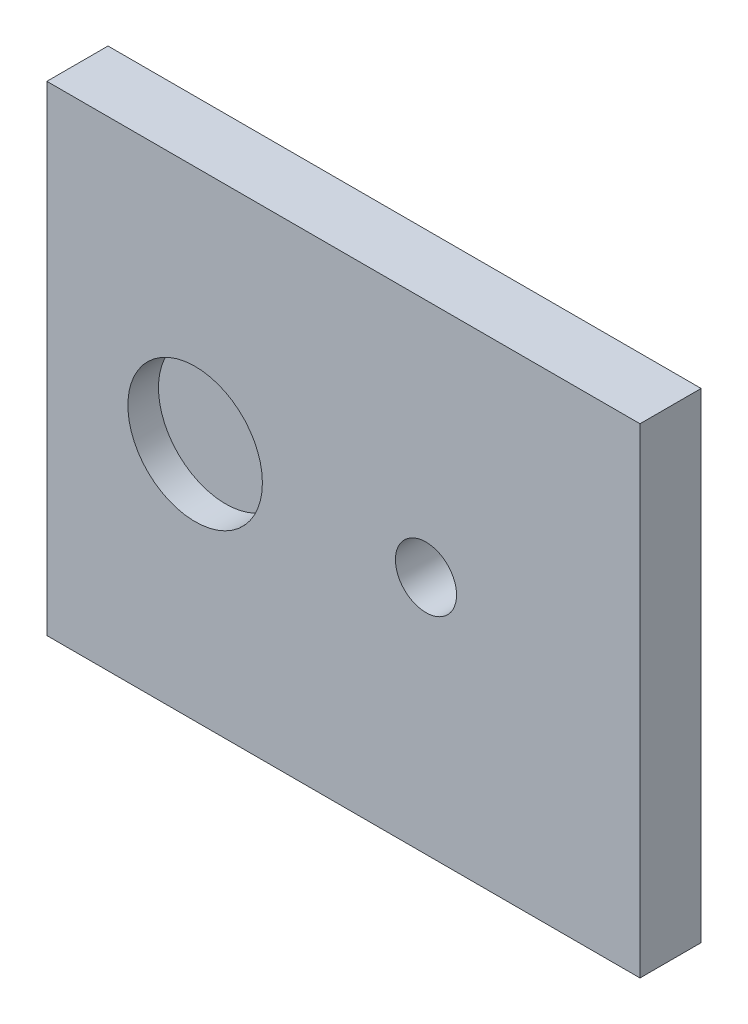
ISO-10303-21;
HEADER;
FILE_DESCRIPTION(('STEP AP214'),'2;1');
FILE_NAME('part.step','',(''),(''),'','','');
FILE_SCHEMA(('AUTOMOTIVE_DESIGN { 1 0 10303 214 1 1 1 1 }'));
ENDSEC;
DATA;
#1=APPLICATION_CONTEXT('core data for automotive mechanical design processes');
#2=APPLICATION_PROTOCOL_DEFINITION('international standard','automotive_design',2000,#1);
#3=PRODUCT_CONTEXT('',#1,'mechanical');
#4=PRODUCT('Part','Part','',(#3));
#5=PRODUCT_RELATED_PRODUCT_CATEGORY('part','',(#4));
#6=PRODUCT_DEFINITION_FORMATION('','',#4);
#7=PRODUCT_DEFINITION_CONTEXT('part definition',#1,'design');
#8=PRODUCT_DEFINITION('design','',#6,#7);
#9=PRODUCT_DEFINITION_SHAPE('','',#8);
#10=(LENGTH_UNIT() NAMED_UNIT(*) SI_UNIT(.MILLI.,.METRE.));
#11=(NAMED_UNIT(*) PLANE_ANGLE_UNIT() SI_UNIT($,.RADIAN.));
#12=(NAMED_UNIT(*) SI_UNIT($,.STERADIAN.) SOLID_ANGLE_UNIT());
#13=UNCERTAINTY_MEASURE_WITH_UNIT(LENGTH_MEASURE(1.E-05),#10,'distance_accuracy_value','');
#14=(GEOMETRIC_REPRESENTATION_CONTEXT(3) GLOBAL_UNCERTAINTY_ASSIGNED_CONTEXT((#13)) GLOBAL_UNIT_ASSIGNED_CONTEXT((#10,
#11,#12)) REPRESENTATION_CONTEXT('',''));
#15=CARTESIAN_POINT('',(0.,0.,0.));
#16=DIRECTION('',(0.,0.,1.));
#17=DIRECTION('',(1.,0.,0.));
#18=AXIS2_PLACEMENT_3D('',#15,#16,#17);
#19=CARTESIAN_POINT('',(48.5,-39.25,10.));
#20=DIRECTION('',(-1.,0.,0.));
#21=DIRECTION('',(0.,0.,1.));
#22=AXIS2_PLACEMENT_3D('',#19,#20,#21);
#23=PLANE('',#22);
#24=DIRECTION('',(0.,1.,0.));
#25=VECTOR('',#24,1.);
#26=CARTESIAN_POINT('',(48.5,-39.25,0.));
#27=LINE('',#26,#25);
#28=CARTESIAN_POINT('',(48.5,-39.25,0.));
#29=VERTEX_POINT('',#28);
#30=CARTESIAN_POINT('',(48.5,39.25,0.));
#31=VERTEX_POINT('',#30);
#32=EDGE_CURVE('E101',#29,#31,#27,.T.);
#33=ORIENTED_EDGE('',*,*,#32,.T.);
#34=DIRECTION('',(0.,0.,-1.));
#35=VECTOR('',#34,1.);
#36=CARTESIAN_POINT('',(48.5,39.25,10.));
#37=LINE('',#36,#35);
#38=CARTESIAN_POINT('',(48.5,39.25,10.));
#39=VERTEX_POINT('',#38);
#40=EDGE_CURVE('E11',#39,#31,#37,.T.);
#41=ORIENTED_EDGE('',*,*,#40,.F.);
#42=DIRECTION('',(0.,1.,0.));
#43=VECTOR('',#42,1.);
#44=CARTESIAN_POINT('',(48.5,-39.25,10.));
#45=LINE('',#44,#43);
#46=CARTESIAN_POINT('',(48.5,-39.25,10.));
#47=VERTEX_POINT('',#46);
#48=EDGE_CURVE('E89',#47,#39,#45,.T.);
#49=ORIENTED_EDGE('',*,*,#48,.F.);
#50=DIRECTION('',(0.,0.,-1.));
#51=VECTOR('',#50,1.);
#52=CARTESIAN_POINT('',(48.5,-39.25,10.));
#53=LINE('',#52,#51);
#54=EDGE_CURVE('E97',#47,#29,#53,.T.);
#55=ORIENTED_EDGE('',*,*,#54,.T.);
#56=EDGE_LOOP('',(#33,#41,#49,#55));
#57=FACE_BOUND('',#56,.T.);
#58=ADVANCED_FACE('F38',(#57),#23,.F.);
#59=CARTESIAN_POINT('',(-48.5,39.25,10.));
#60=DIRECTION('',(0.,-1.,0.));
#61=DIRECTION('',(0.,0.,-1.));
#62=AXIS2_PLACEMENT_3D('',#59,#60,#61);
#63=PLANE('',#62);
#64=DIRECTION('',(-1.,0.,0.));
#65=VECTOR('',#64,1.);
#66=CARTESIAN_POINT('',(-48.5,39.25,0.));
#67=LINE('',#66,#65);
#68=CARTESIAN_POINT('',(-48.5,39.25,0.));
#69=VERTEX_POINT('',#68);
#70=EDGE_CURVE('E93',#31,#69,#67,.T.);
#71=ORIENTED_EDGE('',*,*,#70,.T.);
#72=DIRECTION('',(0.,0.,-1.));
#73=VECTOR('',#72,1.);
#74=CARTESIAN_POINT('',(-48.5,39.25,10.));
#75=LINE('',#74,#73);
#76=CARTESIAN_POINT('',(-48.5,39.25,10.));
#77=VERTEX_POINT('',#76);
#78=EDGE_CURVE('E46',#77,#69,#75,.T.);
#79=ORIENTED_EDGE('',*,*,#78,.F.);
#80=DIRECTION('',(-1.,0.,0.));
#81=VECTOR('',#80,1.);
#82=CARTESIAN_POINT('',(-48.5,39.25,10.));
#83=LINE('',#82,#81);
#84=EDGE_CURVE('E84',#39,#77,#83,.T.);
#85=ORIENTED_EDGE('',*,*,#84,.F.);
#86=ORIENTED_EDGE('',*,*,#40,.T.);
#87=EDGE_LOOP('',(#71,#79,#85,#86));
#88=FACE_BOUND('',#87,.T.);
#89=ADVANCED_FACE('F92',(#88),#63,.F.);
#90=CARTESIAN_POINT('',(-48.5,-39.25,10.));
#91=DIRECTION('',(1.,0.,0.));
#92=DIRECTION('',(0.,0.,-1.));
#93=AXIS2_PLACEMENT_3D('',#90,#91,#92);
#94=PLANE('',#93);
#95=DIRECTION('',(0.,-1.,0.));
#96=VECTOR('',#95,1.);
#97=CARTESIAN_POINT('',(-48.5,-39.25,0.));
#98=LINE('',#97,#96);
#99=CARTESIAN_POINT('',(-48.5,-39.25,0.));
#100=VERTEX_POINT('',#99);
#101=EDGE_CURVE('E71',#69,#100,#98,.T.);
#102=ORIENTED_EDGE('',*,*,#101,.T.);
#103=DIRECTION('',(0.,0.,-1.));
#104=VECTOR('',#103,1.);
#105=CARTESIAN_POINT('',(-48.5,-39.25,10.));
#106=LINE('',#105,#104);
#107=CARTESIAN_POINT('',(-48.5,-39.25,10.));
#108=VERTEX_POINT('',#107);
#109=EDGE_CURVE('E94',#108,#100,#106,.T.);
#110=ORIENTED_EDGE('',*,*,#109,.F.);
#111=DIRECTION('',(0.,-1.,0.));
#112=VECTOR('',#111,1.);
#113=CARTESIAN_POINT('',(-48.5,-39.25,10.));
#114=LINE('',#113,#112);
#115=EDGE_CURVE('E87',#77,#108,#114,.T.);
#116=ORIENTED_EDGE('',*,*,#115,.F.);
#117=ORIENTED_EDGE('',*,*,#78,.T.);
#118=EDGE_LOOP('',(#102,#110,#116,#117));
#119=FACE_BOUND('',#118,.T.);
#120=ADVANCED_FACE('F95',(#119),#94,.F.);
#121=CARTESIAN_POINT('',(-48.5,-39.25,10.));
#122=DIRECTION('',(0.,1.,0.));
#123=DIRECTION('',(0.,0.,1.));
#124=AXIS2_PLACEMENT_3D('',#121,#122,#123);
#125=PLANE('',#124);
#126=DIRECTION('',(1.,0.,0.));
#127=VECTOR('',#126,1.);
#128=CARTESIAN_POINT('',(-48.5,-39.25,0.));
#129=LINE('',#128,#127);
#130=EDGE_CURVE('E77',#100,#29,#129,.T.);
#131=ORIENTED_EDGE('',*,*,#130,.T.);
#132=ORIENTED_EDGE('',*,*,#54,.F.);
#133=DIRECTION('',(1.,0.,0.));
#134=VECTOR('',#133,1.);
#135=CARTESIAN_POINT('',(-48.5,-39.25,10.));
#136=LINE('',#135,#134);
#137=EDGE_CURVE('E54',#108,#47,#136,.T.);
#138=ORIENTED_EDGE('',*,*,#137,.F.);
#139=ORIENTED_EDGE('',*,*,#109,.T.);
#140=EDGE_LOOP('',(#131,#132,#138,#139));
#141=FACE_BOUND('',#140,.T.);
#142=ADVANCED_FACE('F109',(#141),#125,.F.);
#143=CARTESIAN_POINT('',(0.,0.,10.));
#144=DIRECTION('',(0.,0.,-1.));
#145=DIRECTION('',(-1.,0.,0.));
#146=AXIS2_PLACEMENT_3D('',#143,#144,#145);
#147=PLANE('',#146);
#148=CARTESIAN_POINT('',(-24.25,0.,10.));
#149=DIRECTION('',(0.,0.,1.));
#150=DIRECTION('',(1.,0.,0.));
#151=AXIS2_PLACEMENT_3D('',#148,#149,#150);
#152=CIRCLE('',#151,11.);
#153=CARTESIAN_POINT('',(-13.25,0.,10.));
#154=VERTEX_POINT('',#153);
#155=EDGE_CURVE('E121',#154,#154,#152,.T.);
#156=ORIENTED_EDGE('',*,*,#155,.F.);
#157=EDGE_LOOP('',(#156));
#158=FACE_BOUND('',#157,.T.);
#159=CARTESIAN_POINT('',(13.5,0.,10.));
#160=DIRECTION('',(0.,0.,1.));
#161=DIRECTION('',(1.,0.,0.));
#162=AXIS2_PLACEMENT_3D('',#159,#160,#161);
#163=CIRCLE('',#162,5.);
#164=CARTESIAN_POINT('',(18.5,0.,10.));
#165=VERTEX_POINT('',#164);
#166=EDGE_CURVE('E104',#165,#165,#163,.T.);
#167=ORIENTED_EDGE('',*,*,#166,.F.);
#168=EDGE_LOOP('',(#167));
#169=FACE_BOUND('',#168,.T.);
#170=ORIENTED_EDGE('',*,*,#48,.T.);
#171=ORIENTED_EDGE('',*,*,#84,.T.);
#172=ORIENTED_EDGE('',*,*,#115,.T.);
#173=ORIENTED_EDGE('',*,*,#137,.T.);
#174=EDGE_LOOP('',(#170,#171,#172,#173));
#175=FACE_BOUND('',#174,.T.);
#176=ADVANCED_FACE('F85',(#158,#169,#175),#147,.F.);
#177=CARTESIAN_POINT('',(0.,0.,0.));
#178=DIRECTION('',(0.,0.,-1.));
#179=DIRECTION('',(-1.,0.,0.));
#180=AXIS2_PLACEMENT_3D('',#177,#178,#179);
#181=PLANE('',#180);
#182=CARTESIAN_POINT('',(13.5,0.,0.));
#183=DIRECTION('',(0.,0.,-1.));
#184=DIRECTION('',(-1.,0.,0.));
#185=AXIS2_PLACEMENT_3D('',#182,#183,#184);
#186=CIRCLE('',#185,5.);
#187=CARTESIAN_POINT('',(8.5,0.,0.));
#188=VERTEX_POINT('',#187);
#189=EDGE_CURVE('E115',#188,#188,#186,.F.);
#190=ORIENTED_EDGE('',*,*,#189,.T.);
#191=EDGE_LOOP('',(#190));
#192=FACE_BOUND('',#191,.T.);
#193=ORIENTED_EDGE('',*,*,#32,.F.);
#194=ORIENTED_EDGE('',*,*,#130,.F.);
#195=ORIENTED_EDGE('',*,*,#101,.F.);
#196=ORIENTED_EDGE('',*,*,#70,.F.);
#197=EDGE_LOOP('',(#193,#194,#195,#196));
#198=FACE_BOUND('',#197,.T.);
#199=ADVANCED_FACE('F112',(#192,#198),#181,.T.);
#200=CARTESIAN_POINT('',(13.5,0.,-0.000999999999999265));
#201=DIRECTION('',(0.,0.,1.));
#202=DIRECTION('',(1.,0.,0.));
#203=AXIS2_PLACEMENT_3D('',#200,#201,#202);
#204=CYLINDRICAL_SURFACE('',#203,5.);
#205=ORIENTED_EDGE('',*,*,#189,.F.);
#206=EDGE_LOOP('',(#205));
#207=FACE_BOUND('',#206,.T.);
#208=ORIENTED_EDGE('',*,*,#166,.T.);
#209=EDGE_LOOP('',(#208));
#210=FACE_BOUND('',#209,.T.);
#211=ADVANCED_FACE('F132',(#207,#210),#204,.F.);
#212=CARTESIAN_POINT('',(-24.25,0.,5.));
#213=DIRECTION('',(0.,0.,1.));
#214=DIRECTION('',(1.,0.,0.));
#215=AXIS2_PLACEMENT_3D('',#212,#213,#214);
#216=CYLINDRICAL_SURFACE('',#215,11.);
#217=CARTESIAN_POINT('',(-24.25,0.,5.));
#218=DIRECTION('',(0.,0.,1.));
#219=DIRECTION('',(1.,0.,0.));
#220=AXIS2_PLACEMENT_3D('',#217,#218,#219);
#221=CIRCLE('',#220,11.);
#222=CARTESIAN_POINT('',(-13.25,0.,5.));
#223=VERTEX_POINT('',#222);
#224=EDGE_CURVE('E118',#223,#223,#221,.T.);
#225=ORIENTED_EDGE('',*,*,#224,.F.);
#226=EDGE_LOOP('',(#225));
#227=FACE_BOUND('',#226,.T.);
#228=ORIENTED_EDGE('',*,*,#155,.T.);
#229=EDGE_LOOP('',(#228));
#230=FACE_BOUND('',#229,.T.);
#231=ADVANCED_FACE('F129',(#227,#230),#216,.F.);
#232=CARTESIAN_POINT('',(-24.25,0.,5.));
#233=DIRECTION('',(0.,0.,1.));
#234=DIRECTION('',(1.,0.,0.));
#235=AXIS2_PLACEMENT_3D('',#232,#233,#234);
#236=PLANE('',#235);
#237=ORIENTED_EDGE('',*,*,#224,.T.);
#238=EDGE_LOOP('',(#237));
#239=FACE_BOUND('',#238,.T.);
#240=ADVANCED_FACE('F127',(#239),#236,.T.);
#241=CLOSED_SHELL('',(#58,#89,#120,#142,#176,#199,#211,#231,#240));
#242=MANIFOLD_SOLID_BREP('B2',#241);
#243=ADVANCED_BREP_SHAPE_REPRESENTATION('',(#18,#242),#14);
#244=SHAPE_DEFINITION_REPRESENTATION(#9,#243);
ENDSEC;
END-ISO-10303-21;
